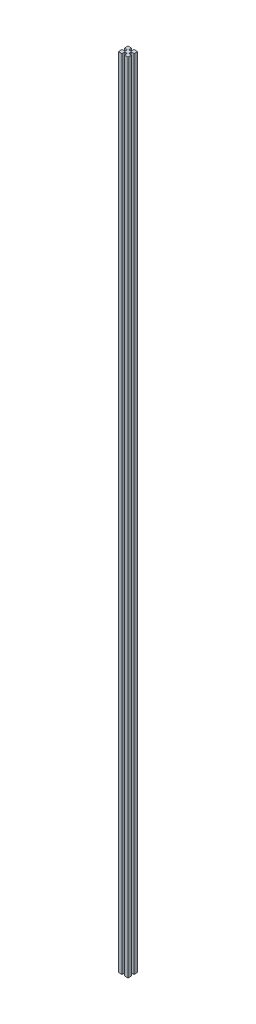
ISO-10303-21;
HEADER;
FILE_DESCRIPTION(('STEP AP214'),'2;1');
FILE_NAME('part.step','',(''),(''),'','','');
FILE_SCHEMA(('AUTOMOTIVE_DESIGN { 1 0 10303 214 1 1 1 1 }'));
ENDSEC;
DATA;
#1=APPLICATION_CONTEXT('core data for automotive mechanical design processes');
#2=APPLICATION_PROTOCOL_DEFINITION('international standard','automotive_design',2000,#1);
#3=PRODUCT_CONTEXT('',#1,'mechanical');
#4=PRODUCT('Part','Part','',(#3));
#5=PRODUCT_RELATED_PRODUCT_CATEGORY('part','',(#4));
#6=PRODUCT_DEFINITION_FORMATION('','',#4);
#7=PRODUCT_DEFINITION_CONTEXT('part definition',#1,'design');
#8=PRODUCT_DEFINITION('design','',#6,#7);
#9=PRODUCT_DEFINITION_SHAPE('','',#8);
#10=(LENGTH_UNIT() NAMED_UNIT(*) SI_UNIT(.MILLI.,.METRE.));
#11=(NAMED_UNIT(*) PLANE_ANGLE_UNIT() SI_UNIT($,.RADIAN.));
#12=(NAMED_UNIT(*) SI_UNIT($,.STERADIAN.) SOLID_ANGLE_UNIT());
#13=UNCERTAINTY_MEASURE_WITH_UNIT(LENGTH_MEASURE(1.E-05),#10,'distance_accuracy_value','');
#14=(GEOMETRIC_REPRESENTATION_CONTEXT(3) GLOBAL_UNCERTAINTY_ASSIGNED_CONTEXT((#13)) GLOBAL_UNIT_ASSIGNED_CONTEXT((#10,
#11,#12)) REPRESENTATION_CONTEXT('',''));
#15=CARTESIAN_POINT('',(0.,0.,0.));
#16=DIRECTION('',(0.,0.,1.));
#17=DIRECTION('',(1.,0.,0.));
#18=AXIS2_PLACEMENT_3D('',#15,#16,#17);
#19=CARTESIAN_POINT('',(10.,-825.5,10.));
#20=DIRECTION('',(1.,0.,0.));
#21=DIRECTION('',(0.,0.,-1.));
#22=AXIS2_PLACEMENT_3D('',#19,#20,#21);
#23=PLANE('',#22);
#24=DIRECTION('',(0.,-1.,0.));
#25=VECTOR('',#24,1.);
#26=CARTESIAN_POINT('',(10.,-825.5,2.5));
#27=LINE('',#26,#25);
#28=CARTESIAN_POINT('',(10.,825.5,2.5));
#29=VERTEX_POINT('',#28);
#30=CARTESIAN_POINT('',(10.,-825.5,2.5));
#31=VERTEX_POINT('',#30);
#32=EDGE_CURVE('E264',#29,#31,#27,.T.);
#33=ORIENTED_EDGE('',*,*,#32,.F.);
#34=DIRECTION('',(0.,0.,-1.));
#35=VECTOR('',#34,1.);
#36=CARTESIAN_POINT('',(10.,825.5,10.));
#37=LINE('',#36,#35);
#38=CARTESIAN_POINT('',(10.,825.5,10.));
#39=VERTEX_POINT('',#38);
#40=EDGE_CURVE('E270',#39,#29,#37,.T.);
#41=ORIENTED_EDGE('',*,*,#40,.F.);
#42=DIRECTION('',(0.,1.,0.));
#43=VECTOR('',#42,1.);
#44=CARTESIAN_POINT('',(10.,-825.5,10.));
#45=LINE('',#44,#43);
#46=CARTESIAN_POINT('',(10.,-825.5,10.));
#47=VERTEX_POINT('',#46);
#48=EDGE_CURVE('E301',#47,#39,#45,.T.);
#49=ORIENTED_EDGE('',*,*,#48,.F.);
#50=DIRECTION('',(0.,0.,-1.));
#51=VECTOR('',#50,1.);
#52=CARTESIAN_POINT('',(10.,-825.5,10.));
#53=LINE('',#52,#51);
#54=EDGE_CURVE('E285',#47,#31,#53,.T.);
#55=ORIENTED_EDGE('',*,*,#54,.T.);
#56=EDGE_LOOP('',(#33,#41,#49,#55));
#57=FACE_BOUND('',#56,.T.);
#58=ADVANCED_FACE('F33',(#57),#23,.T.);
#59=CARTESIAN_POINT('',(-10.,-825.5,10.));
#60=DIRECTION('',(0.,0.,1.));
#61=DIRECTION('',(1.,0.,0.));
#62=AXIS2_PLACEMENT_3D('',#59,#60,#61);
#63=PLANE('',#62);
#64=DIRECTION('',(0.,1.,0.));
#65=VECTOR('',#64,1.);
#66=CARTESIAN_POINT('',(2.5,-825.5,10.));
#67=LINE('',#66,#65);
#68=CARTESIAN_POINT('',(2.5,-825.5,10.));
#69=VERTEX_POINT('',#68);
#70=CARTESIAN_POINT('',(2.5,825.5,10.));
#71=VERTEX_POINT('',#70);
#72=EDGE_CURVE('E257',#69,#71,#67,.T.);
#73=ORIENTED_EDGE('',*,*,#72,.F.);
#74=DIRECTION('',(1.,0.,0.));
#75=VECTOR('',#74,1.);
#76=CARTESIAN_POINT('',(-10.,-825.5,10.));
#77=LINE('',#76,#75);
#78=EDGE_CURVE('E296',#69,#47,#77,.T.);
#79=ORIENTED_EDGE('',*,*,#78,.T.);
#80=ORIENTED_EDGE('',*,*,#48,.T.);
#81=DIRECTION('',(1.,0.,0.));
#82=VECTOR('',#81,1.);
#83=CARTESIAN_POINT('',(-10.,825.5,10.));
#84=LINE('',#83,#82);
#85=EDGE_CURVE('E280',#71,#39,#84,.T.);
#86=ORIENTED_EDGE('',*,*,#85,.F.);
#87=EDGE_LOOP('',(#73,#79,#80,#86));
#88=FACE_BOUND('',#87,.T.);
#89=ADVANCED_FACE('F375',(#88),#63,.T.);
#90=CARTESIAN_POINT('',(-10.,-825.5,10.));
#91=DIRECTION('',(-1.,0.,0.));
#92=DIRECTION('',(0.,0.,1.));
#93=AXIS2_PLACEMENT_3D('',#90,#91,#92);
#94=PLANE('',#93);
#95=DIRECTION('',(0.,-1.,0.));
#96=VECTOR('',#95,1.);
#97=CARTESIAN_POINT('',(-10.,-825.5,-2.5));
#98=LINE('',#97,#96);
#99=CARTESIAN_POINT('',(-10.,825.5,-2.5));
#100=VERTEX_POINT('',#99);
#101=CARTESIAN_POINT('',(-10.,-825.5,-2.5));
#102=VERTEX_POINT('',#101);
#103=EDGE_CURVE('E260',#100,#102,#98,.T.);
#104=ORIENTED_EDGE('',*,*,#103,.F.);
#105=DIRECTION('',(0.,0.,1.));
#106=VECTOR('',#105,1.);
#107=CARTESIAN_POINT('',(-10.,825.5,10.));
#108=LINE('',#107,#106);
#109=CARTESIAN_POINT('',(-10.,825.5,-10.));
#110=VERTEX_POINT('',#109);
#111=EDGE_CURVE('E277',#110,#100,#108,.T.);
#112=ORIENTED_EDGE('',*,*,#111,.F.);
#113=DIRECTION('',(0.,1.,0.));
#114=VECTOR('',#113,1.);
#115=CARTESIAN_POINT('',(-10.,-825.5,-10.));
#116=LINE('',#115,#114);
#117=CARTESIAN_POINT('',(-10.,-825.5,-10.));
#118=VERTEX_POINT('',#117);
#119=EDGE_CURVE('E308',#118,#110,#116,.T.);
#120=ORIENTED_EDGE('',*,*,#119,.F.);
#121=DIRECTION('',(0.,0.,1.));
#122=VECTOR('',#121,1.);
#123=CARTESIAN_POINT('',(-10.,-825.5,10.));
#124=LINE('',#123,#122);
#125=EDGE_CURVE('E293',#118,#102,#124,.T.);
#126=ORIENTED_EDGE('',*,*,#125,.T.);
#127=EDGE_LOOP('',(#104,#112,#120,#126));
#128=FACE_BOUND('',#127,.T.);
#129=ADVANCED_FACE('F345',(#128),#94,.T.);
#130=CARTESIAN_POINT('',(-10.,-825.5,-10.));
#131=DIRECTION('',(0.,0.,-1.));
#132=DIRECTION('',(-1.,0.,0.));
#133=AXIS2_PLACEMENT_3D('',#130,#131,#132);
#134=PLANE('',#133);
#135=DIRECTION('',(0.,-1.,0.));
#136=VECTOR('',#135,1.);
#137=CARTESIAN_POINT('',(2.5,-825.5,-10.));
#138=LINE('',#137,#136);
#139=CARTESIAN_POINT('',(2.5,825.5,-10.));
#140=VERTEX_POINT('',#139);
#141=CARTESIAN_POINT('',(2.5,-825.5,-10.));
#142=VERTEX_POINT('',#141);
#143=EDGE_CURVE('E267',#140,#142,#138,.T.);
#144=ORIENTED_EDGE('',*,*,#143,.F.);
#145=DIRECTION('',(-1.,0.,0.));
#146=VECTOR('',#145,1.);
#147=CARTESIAN_POINT('',(-10.,825.5,-10.));
#148=LINE('',#147,#146);
#149=CARTESIAN_POINT('',(10.,825.5,-10.));
#150=VERTEX_POINT('',#149);
#151=EDGE_CURVE('E274',#150,#140,#148,.T.);
#152=ORIENTED_EDGE('',*,*,#151,.F.);
#153=DIRECTION('',(0.,1.,0.));
#154=VECTOR('',#153,1.);
#155=CARTESIAN_POINT('',(10.,-825.5,-10.));
#156=LINE('',#155,#154);
#157=CARTESIAN_POINT('',(10.,-825.5,-10.));
#158=VERTEX_POINT('',#157);
#159=EDGE_CURVE('E300',#158,#150,#156,.T.);
#160=ORIENTED_EDGE('',*,*,#159,.F.);
#161=DIRECTION('',(-1.,0.,0.));
#162=VECTOR('',#161,1.);
#163=CARTESIAN_POINT('',(-10.,-825.5,-10.));
#164=LINE('',#163,#162);
#165=EDGE_CURVE('E289',#158,#142,#164,.T.);
#166=ORIENTED_EDGE('',*,*,#165,.T.);
#167=EDGE_LOOP('',(#144,#152,#160,#166));
#168=FACE_BOUND('',#167,.T.);
#169=ADVANCED_FACE('F329',(#168),#134,.T.);
#170=DIRECTION('',(0.,1.,0.));
#171=VECTOR('',#170,1.);
#172=CARTESIAN_POINT('',(10.,-825.5,-2.5));
#173=LINE('',#172,#171);
#174=CARTESIAN_POINT('',(10.,-825.5,-2.5));
#175=VERTEX_POINT('',#174);
#176=CARTESIAN_POINT('',(10.,825.5,-2.5));
#177=VERTEX_POINT('',#176);
#178=EDGE_CURVE('E262',#175,#177,#173,.T.);
#179=ORIENTED_EDGE('',*,*,#178,.F.);
#180=EDGE_CURVE('E284',#175,#158,#53,.T.);
#181=ORIENTED_EDGE('',*,*,#180,.T.);
#182=ORIENTED_EDGE('',*,*,#159,.T.);
#183=EDGE_CURVE('E269',#177,#150,#37,.T.);
#184=ORIENTED_EDGE('',*,*,#183,.F.);
#185=EDGE_LOOP('',(#179,#181,#182,#184));
#186=FACE_BOUND('',#185,.T.);
#187=ADVANCED_FACE('F35',(#186),#23,.T.);
#188=DIRECTION('',(0.,-1.,0.));
#189=VECTOR('',#188,1.);
#190=CARTESIAN_POINT('',(-2.5,-825.5,10.));
#191=LINE('',#190,#189);
#192=CARTESIAN_POINT('',(-2.5,825.5,10.));
#193=VERTEX_POINT('',#192);
#194=CARTESIAN_POINT('',(-2.5,-825.5,10.));
#195=VERTEX_POINT('',#194);
#196=EDGE_CURVE('E201',#193,#195,#191,.T.);
#197=ORIENTED_EDGE('',*,*,#196,.F.);
#198=CARTESIAN_POINT('',(-10.,825.5,10.));
#199=VERTEX_POINT('',#198);
#200=EDGE_CURVE('E281',#199,#193,#84,.T.);
#201=ORIENTED_EDGE('',*,*,#200,.F.);
#202=DIRECTION('',(0.,1.,0.));
#203=VECTOR('',#202,1.);
#204=CARTESIAN_POINT('',(-10.,-825.5,10.));
#205=LINE('',#204,#203);
#206=CARTESIAN_POINT('',(-10.,-825.5,10.));
#207=VERTEX_POINT('',#206);
#208=EDGE_CURVE('E305',#207,#199,#205,.T.);
#209=ORIENTED_EDGE('',*,*,#208,.F.);
#210=EDGE_CURVE('E297',#207,#195,#77,.T.);
#211=ORIENTED_EDGE('',*,*,#210,.T.);
#212=EDGE_LOOP('',(#197,#201,#209,#211));
#213=FACE_BOUND('',#212,.T.);
#214=ADVANCED_FACE('F361',(#213),#63,.T.);
#215=DIRECTION('',(0.,1.,0.));
#216=VECTOR('',#215,1.);
#217=CARTESIAN_POINT('',(-10.,-825.5,2.5));
#218=LINE('',#217,#216);
#219=CARTESIAN_POINT('',(-10.,-825.5,2.5));
#220=VERTEX_POINT('',#219);
#221=CARTESIAN_POINT('',(-10.,825.5,2.5));
#222=VERTEX_POINT('',#221);
#223=EDGE_CURVE('E56',#220,#222,#218,.T.);
#224=ORIENTED_EDGE('',*,*,#223,.F.);
#225=EDGE_CURVE('E292',#220,#207,#124,.T.);
#226=ORIENTED_EDGE('',*,*,#225,.T.);
#227=ORIENTED_EDGE('',*,*,#208,.T.);
#228=EDGE_CURVE('E276',#222,#199,#108,.T.);
#229=ORIENTED_EDGE('',*,*,#228,.F.);
#230=EDGE_LOOP('',(#224,#226,#227,#229));
#231=FACE_BOUND('',#230,.T.);
#232=ADVANCED_FACE('F355',(#231),#94,.T.);
#233=DIRECTION('',(0.,1.,0.));
#234=VECTOR('',#233,1.);
#235=CARTESIAN_POINT('',(-2.5,-825.5,-10.));
#236=LINE('',#235,#234);
#237=CARTESIAN_POINT('',(-2.5,-825.5,-10.));
#238=VERTEX_POINT('',#237);
#239=CARTESIAN_POINT('',(-2.5,825.5,-10.));
#240=VERTEX_POINT('',#239);
#241=EDGE_CURVE('E174',#238,#240,#236,.T.);
#242=ORIENTED_EDGE('',*,*,#241,.F.);
#243=EDGE_CURVE('E288',#238,#118,#164,.T.);
#244=ORIENTED_EDGE('',*,*,#243,.T.);
#245=ORIENTED_EDGE('',*,*,#119,.T.);
#246=EDGE_CURVE('E273',#240,#110,#148,.T.);
#247=ORIENTED_EDGE('',*,*,#246,.F.);
#248=EDGE_LOOP('',(#242,#244,#245,#247));
#249=FACE_BOUND('',#248,.T.);
#250=ADVANCED_FACE('F338',(#249),#134,.T.);
#251=CARTESIAN_POINT('',(0.,-825.5,0.));
#252=DIRECTION('',(0.,-1.,0.));
#253=DIRECTION('',(0.,0.,-1.));
#254=AXIS2_PLACEMENT_3D('',#251,#252,#253);
#255=PLANE('',#254);
#256=DIRECTION('',(0.,0.,-1.));
#257=VECTOR('',#256,1.);
#258=CARTESIAN_POINT('',(2.5,-825.5,-4.00000000000001));
#259=LINE('',#258,#257);
#260=CARTESIAN_POINT('',(2.5,-825.5,-4.00000000000001));
#261=VERTEX_POINT('',#260);
#262=EDGE_CURVE('E191',#261,#142,#259,.T.);
#263=ORIENTED_EDGE('',*,*,#262,.T.);
#264=ORIENTED_EDGE('',*,*,#165,.F.);
#265=ORIENTED_EDGE('',*,*,#180,.F.);
#266=DIRECTION('',(-1.,0.,0.));
#267=VECTOR('',#266,1.);
#268=CARTESIAN_POINT('',(4.,-825.5,-2.5));
#269=LINE('',#268,#267);
#270=CARTESIAN_POINT('',(4.,-825.5,-2.5));
#271=VERTEX_POINT('',#270);
#272=EDGE_CURVE('E209',#175,#271,#269,.T.);
#273=ORIENTED_EDGE('',*,*,#272,.T.);
#274=DIRECTION('',(0.,0.,1.));
#275=VECTOR('',#274,1.);
#276=CARTESIAN_POINT('',(4.,-825.5,-2.5));
#277=LINE('',#276,#275);
#278=CARTESIAN_POINT('',(4.,-825.5,2.5));
#279=VERTEX_POINT('',#278);
#280=EDGE_CURVE('E212',#271,#279,#277,.T.);
#281=ORIENTED_EDGE('',*,*,#280,.T.);
#282=DIRECTION('',(1.,0.,0.));
#283=VECTOR('',#282,1.);
#284=CARTESIAN_POINT('',(4.,-825.5,2.5));
#285=LINE('',#284,#283);
#286=EDGE_CURVE('E215',#279,#31,#285,.T.);
#287=ORIENTED_EDGE('',*,*,#286,.T.);
#288=ORIENTED_EDGE('',*,*,#54,.F.);
#289=ORIENTED_EDGE('',*,*,#78,.F.);
#290=DIRECTION('',(0.,0.,-1.));
#291=VECTOR('',#290,1.);
#292=CARTESIAN_POINT('',(2.5,-825.5,4.));
#293=LINE('',#292,#291);
#294=CARTESIAN_POINT('',(2.5,-825.5,4.));
#295=VERTEX_POINT('',#294);
#296=EDGE_CURVE('E250',#69,#295,#293,.T.);
#297=ORIENTED_EDGE('',*,*,#296,.T.);
#298=DIRECTION('',(-1.,0.,0.));
#299=VECTOR('',#298,1.);
#300=CARTESIAN_POINT('',(-2.5,-825.5,4.));
#301=LINE('',#300,#299);
#302=CARTESIAN_POINT('',(-2.5,-825.5,4.));
#303=VERTEX_POINT('',#302);
#304=EDGE_CURVE('E244',#295,#303,#301,.T.);
#305=ORIENTED_EDGE('',*,*,#304,.T.);
#306=DIRECTION('',(0.,0.,1.));
#307=VECTOR('',#306,1.);
#308=CARTESIAN_POINT('',(-2.5,-825.5,4.));
#309=LINE('',#308,#307);
#310=EDGE_CURVE('E247',#303,#195,#309,.T.);
#311=ORIENTED_EDGE('',*,*,#310,.T.);
#312=ORIENTED_EDGE('',*,*,#210,.F.);
#313=ORIENTED_EDGE('',*,*,#225,.F.);
#314=DIRECTION('',(1.,0.,0.));
#315=VECTOR('',#314,1.);
#316=CARTESIAN_POINT('',(-4.00000000000001,-825.5,2.5));
#317=LINE('',#316,#315);
#318=CARTESIAN_POINT('',(-4.00000000000001,-825.5,2.5));
#319=VERTEX_POINT('',#318);
#320=EDGE_CURVE('E231',#220,#319,#317,.T.);
#321=ORIENTED_EDGE('',*,*,#320,.T.);
#322=DIRECTION('',(0.,0.,-1.));
#323=VECTOR('',#322,1.);
#324=CARTESIAN_POINT('',(-4.00000000000001,-825.5,-2.5));
#325=LINE('',#324,#323);
#326=CARTESIAN_POINT('',(-4.00000000000001,-825.5,-2.5));
#327=VERTEX_POINT('',#326);
#328=EDGE_CURVE('E234',#319,#327,#325,.T.);
#329=ORIENTED_EDGE('',*,*,#328,.T.);
#330=DIRECTION('',(-1.,0.,0.));
#331=VECTOR('',#330,1.);
#332=CARTESIAN_POINT('',(-4.00000000000001,-825.5,-2.5));
#333=LINE('',#332,#331);
#334=EDGE_CURVE('E228',#327,#102,#333,.T.);
#335=ORIENTED_EDGE('',*,*,#334,.T.);
#336=ORIENTED_EDGE('',*,*,#125,.F.);
#337=ORIENTED_EDGE('',*,*,#243,.F.);
#338=DIRECTION('',(0.,0.,1.));
#339=VECTOR('',#338,1.);
#340=CARTESIAN_POINT('',(-2.5,-825.5,-4.00000000000001));
#341=LINE('',#340,#339);
#342=CARTESIAN_POINT('',(-2.5,-825.5,-4.00000000000001));
#343=VERTEX_POINT('',#342);
#344=EDGE_CURVE('E194',#238,#343,#341,.T.);
#345=ORIENTED_EDGE('',*,*,#344,.T.);
#346=DIRECTION('',(1.,0.,0.));
#347=VECTOR('',#346,1.);
#348=CARTESIAN_POINT('',(-2.5,-825.5,-4.00000000000001));
#349=LINE('',#348,#347);
#350=EDGE_CURVE('E184',#343,#261,#349,.T.);
#351=ORIENTED_EDGE('',*,*,#350,.T.);
#352=EDGE_LOOP('',(#263,#264,#265,#273,#281,#287,#288,#289,#297,#305,#311,#312,#313,#321,#329,
#335,#336,#337,#345,#351));
#353=FACE_BOUND('',#352,.T.);
#354=ADVANCED_FACE('F334',(#353),#255,.T.);
#355=CARTESIAN_POINT('',(0.,825.5,0.));
#356=DIRECTION('',(0.,-1.,0.));
#357=DIRECTION('',(0.,0.,-1.));
#358=AXIS2_PLACEMENT_3D('',#355,#356,#357);
#359=PLANE('',#358);
#360=ORIENTED_EDGE('',*,*,#151,.T.);
#361=DIRECTION('',(0.,0.,-1.));
#362=VECTOR('',#361,1.);
#363=CARTESIAN_POINT('',(2.5,825.5,-4.00000000000001));
#364=LINE('',#363,#362);
#365=CARTESIAN_POINT('',(2.5,825.5,-4.00000000000001));
#366=VERTEX_POINT('',#365);
#367=EDGE_CURVE('E190',#366,#140,#364,.T.);
#368=ORIENTED_EDGE('',*,*,#367,.F.);
#369=DIRECTION('',(1.,0.,0.));
#370=VECTOR('',#369,1.);
#371=CARTESIAN_POINT('',(-2.5,825.5,-4.00000000000001));
#372=LINE('',#371,#370);
#373=CARTESIAN_POINT('',(-2.5,825.5,-4.00000000000001));
#374=VERTEX_POINT('',#373);
#375=EDGE_CURVE('E181',#374,#366,#372,.T.);
#376=ORIENTED_EDGE('',*,*,#375,.F.);
#377=DIRECTION('',(0.,0.,-1.));
#378=VECTOR('',#377,1.);
#379=CARTESIAN_POINT('',(-2.5,825.5,0.));
#380=LINE('',#379,#378);
#381=EDGE_CURVE('E11',#374,#240,#380,.T.);
#382=ORIENTED_EDGE('',*,*,#381,.T.);
#383=ORIENTED_EDGE('',*,*,#246,.T.);
#384=ORIENTED_EDGE('',*,*,#111,.T.);
#385=DIRECTION('',(-1.,0.,0.));
#386=VECTOR('',#385,1.);
#387=CARTESIAN_POINT('',(-4.00000000000001,825.5,-2.5));
#388=LINE('',#387,#386);
#389=CARTESIAN_POINT('',(-4.00000000000001,825.5,-2.5));
#390=VERTEX_POINT('',#389);
#391=EDGE_CURVE('E222',#390,#100,#388,.T.);
#392=ORIENTED_EDGE('',*,*,#391,.F.);
#393=DIRECTION('',(0.,0.,-1.));
#394=VECTOR('',#393,1.);
#395=CARTESIAN_POINT('',(-4.00000000000001,825.5,-2.5));
#396=LINE('',#395,#394);
#397=CARTESIAN_POINT('',(-4.00000000000001,825.5,2.5));
#398=VERTEX_POINT('',#397);
#399=EDGE_CURVE('E224',#398,#390,#396,.T.);
#400=ORIENTED_EDGE('',*,*,#399,.F.);
#401=DIRECTION('',(-1.,0.,0.));
#402=VECTOR('',#401,1.);
#403=CARTESIAN_POINT('',(0.,825.5,2.5));
#404=LINE('',#403,#402);
#405=EDGE_CURVE('E315',#398,#222,#404,.T.);
#406=ORIENTED_EDGE('',*,*,#405,.T.);
#407=ORIENTED_EDGE('',*,*,#228,.T.);
#408=ORIENTED_EDGE('',*,*,#200,.T.);
#409=DIRECTION('',(0.,0.,1.));
#410=VECTOR('',#409,1.);
#411=CARTESIAN_POINT('',(-2.5,825.5,4.));
#412=LINE('',#411,#410);
#413=CARTESIAN_POINT('',(-2.5,825.5,4.));
#414=VERTEX_POINT('',#413);
#415=EDGE_CURVE('E242',#414,#193,#412,.T.);
#416=ORIENTED_EDGE('',*,*,#415,.F.);
#417=DIRECTION('',(-1.,0.,0.));
#418=VECTOR('',#417,1.);
#419=CARTESIAN_POINT('',(-2.5,825.5,4.));
#420=LINE('',#419,#418);
#421=CARTESIAN_POINT('',(2.5,825.5,4.));
#422=VERTEX_POINT('',#421);
#423=EDGE_CURVE('E48',#422,#414,#420,.T.);
#424=ORIENTED_EDGE('',*,*,#423,.F.);
#425=DIRECTION('',(0.,0.,1.));
#426=VECTOR('',#425,1.);
#427=CARTESIAN_POINT('',(2.5,825.5,0.));
#428=LINE('',#427,#426);
#429=EDGE_CURVE('E304',#422,#71,#428,.T.);
#430=ORIENTED_EDGE('',*,*,#429,.T.);
#431=ORIENTED_EDGE('',*,*,#85,.T.);
#432=ORIENTED_EDGE('',*,*,#40,.T.);
#433=DIRECTION('',(1.,0.,0.));
#434=VECTOR('',#433,1.);
#435=CARTESIAN_POINT('',(4.,825.5,2.5));
#436=LINE('',#435,#434);
#437=CARTESIAN_POINT('',(4.,825.5,2.5));
#438=VERTEX_POINT('',#437);
#439=EDGE_CURVE('E206',#438,#29,#436,.T.);
#440=ORIENTED_EDGE('',*,*,#439,.F.);
#441=DIRECTION('',(0.,0.,1.));
#442=VECTOR('',#441,1.);
#443=CARTESIAN_POINT('',(4.,825.5,-2.5));
#444=LINE('',#443,#442);
#445=CARTESIAN_POINT('',(4.,825.5,-2.5));
#446=VERTEX_POINT('',#445);
#447=EDGE_CURVE('E203',#446,#438,#444,.T.);
#448=ORIENTED_EDGE('',*,*,#447,.F.);
#449=DIRECTION('',(1.,0.,0.));
#450=VECTOR('',#449,1.);
#451=CARTESIAN_POINT('',(0.,825.5,-2.5));
#452=LINE('',#451,#450);
#453=EDGE_CURVE('E41',#446,#177,#452,.T.);
#454=ORIENTED_EDGE('',*,*,#453,.T.);
#455=ORIENTED_EDGE('',*,*,#183,.T.);
#456=EDGE_LOOP('',(#360,#368,#376,#382,#383,#384,#392,#400,#406,#407,#408,#416,#424,#430,#431,
#432,#440,#448,#454,#455));
#457=FACE_BOUND('',#456,.T.);
#458=ADVANCED_FACE('F189',(#457),#359,.F.);
#459=CARTESIAN_POINT('',(-2.5,-825.5,4.));
#460=DIRECTION('',(0.,0.,-1.));
#461=DIRECTION('',(-1.,0.,0.));
#462=AXIS2_PLACEMENT_3D('',#459,#460,#461);
#463=PLANE('',#462);
#464=DIRECTION('',(0.,1.,0.));
#465=VECTOR('',#464,1.);
#466=CARTESIAN_POINT('',(-2.5,-825.5,4.));
#467=LINE('',#466,#465);
#468=EDGE_CURVE('E253',#303,#414,#467,.T.);
#469=ORIENTED_EDGE('',*,*,#468,.F.);
#470=ORIENTED_EDGE('',*,*,#304,.F.);
#471=DIRECTION('',(0.,1.,0.));
#472=VECTOR('',#471,1.);
#473=CARTESIAN_POINT('',(2.5,-825.5,4.));
#474=LINE('',#473,#472);
#475=EDGE_CURVE('E225',#295,#422,#474,.T.);
#476=ORIENTED_EDGE('',*,*,#475,.T.);
#477=ORIENTED_EDGE('',*,*,#423,.T.);
#478=EDGE_LOOP('',(#469,#470,#476,#477));
#479=FACE_BOUND('',#478,.T.);
#480=ADVANCED_FACE('F367',(#479),#463,.F.);
#481=CARTESIAN_POINT('',(2.5,-825.5,4.));
#482=DIRECTION('',(1.,0.,0.));
#483=DIRECTION('',(0.,0.,-1.));
#484=AXIS2_PLACEMENT_3D('',#481,#482,#483);
#485=PLANE('',#484);
#486=ORIENTED_EDGE('',*,*,#72,.T.);
#487=ORIENTED_EDGE('',*,*,#429,.F.);
#488=ORIENTED_EDGE('',*,*,#475,.F.);
#489=ORIENTED_EDGE('',*,*,#296,.F.);
#490=EDGE_LOOP('',(#486,#487,#488,#489));
#491=FACE_BOUND('',#490,.T.);
#492=ADVANCED_FACE('F372',(#491),#485,.F.);
#493=CARTESIAN_POINT('',(-2.5,-825.5,4.));
#494=DIRECTION('',(-1.,0.,0.));
#495=DIRECTION('',(0.,0.,1.));
#496=AXIS2_PLACEMENT_3D('',#493,#494,#495);
#497=PLANE('',#496);
#498=ORIENTED_EDGE('',*,*,#196,.T.);
#499=ORIENTED_EDGE('',*,*,#310,.F.);
#500=ORIENTED_EDGE('',*,*,#468,.T.);
#501=ORIENTED_EDGE('',*,*,#415,.T.);
#502=EDGE_LOOP('',(#498,#499,#500,#501));
#503=FACE_BOUND('',#502,.T.);
#504=ADVANCED_FACE('F364',(#503),#497,.F.);
#505=CARTESIAN_POINT('',(-4.00000000000001,-825.5,-2.5));
#506=DIRECTION('',(0.,0.,-1.));
#507=DIRECTION('',(-1.,0.,0.));
#508=AXIS2_PLACEMENT_3D('',#505,#506,#507);
#509=PLANE('',#508);
#510=ORIENTED_EDGE('',*,*,#103,.T.);
#511=ORIENTED_EDGE('',*,*,#334,.F.);
#512=DIRECTION('',(0.,1.,0.));
#513=VECTOR('',#512,1.);
#514=CARTESIAN_POINT('',(-4.00000000000001,-825.5,-2.5));
#515=LINE('',#514,#513);
#516=EDGE_CURVE('E207',#327,#390,#515,.T.);
#517=ORIENTED_EDGE('',*,*,#516,.T.);
#518=ORIENTED_EDGE('',*,*,#391,.T.);
#519=EDGE_LOOP('',(#510,#511,#517,#518));
#520=FACE_BOUND('',#519,.T.);
#521=ADVANCED_FACE('F348',(#520),#509,.F.);
#522=CARTESIAN_POINT('',(-4.00000000000001,-825.5,-2.5));
#523=DIRECTION('',(1.,0.,0.));
#524=DIRECTION('',(0.,0.,-1.));
#525=AXIS2_PLACEMENT_3D('',#522,#523,#524);
#526=PLANE('',#525);
#527=ORIENTED_EDGE('',*,*,#516,.F.);
#528=ORIENTED_EDGE('',*,*,#328,.F.);
#529=DIRECTION('',(0.,1.,0.));
#530=VECTOR('',#529,1.);
#531=CARTESIAN_POINT('',(-4.00000000000001,-825.5,2.5));
#532=LINE('',#531,#530);
#533=EDGE_CURVE('E237',#319,#398,#532,.T.);
#534=ORIENTED_EDGE('',*,*,#533,.T.);
#535=ORIENTED_EDGE('',*,*,#399,.T.);
#536=EDGE_LOOP('',(#527,#528,#534,#535));
#537=FACE_BOUND('',#536,.T.);
#538=ADVANCED_FACE('F352',(#537),#526,.F.);
#539=CARTESIAN_POINT('',(-4.00000000000001,-825.5,2.5));
#540=DIRECTION('',(0.,0.,1.));
#541=DIRECTION('',(1.,0.,0.));
#542=AXIS2_PLACEMENT_3D('',#539,#540,#541);
#543=PLANE('',#542);
#544=ORIENTED_EDGE('',*,*,#223,.T.);
#545=ORIENTED_EDGE('',*,*,#405,.F.);
#546=ORIENTED_EDGE('',*,*,#533,.F.);
#547=ORIENTED_EDGE('',*,*,#320,.F.);
#548=EDGE_LOOP('',(#544,#545,#546,#547));
#549=FACE_BOUND('',#548,.T.);
#550=ADVANCED_FACE('F429',(#549),#543,.F.);
#551=CARTESIAN_POINT('',(4.,-825.5,2.5));
#552=DIRECTION('',(0.,0.,1.));
#553=DIRECTION('',(1.,0.,0.));
#554=AXIS2_PLACEMENT_3D('',#551,#552,#553);
#555=PLANE('',#554);
#556=ORIENTED_EDGE('',*,*,#32,.T.);
#557=ORIENTED_EDGE('',*,*,#286,.F.);
#558=DIRECTION('',(0.,1.,0.));
#559=VECTOR('',#558,1.);
#560=CARTESIAN_POINT('',(4.,-825.5,2.5));
#561=LINE('',#560,#559);
#562=EDGE_CURVE('E196',#279,#438,#561,.T.);
#563=ORIENTED_EDGE('',*,*,#562,.T.);
#564=ORIENTED_EDGE('',*,*,#439,.T.);
#565=EDGE_LOOP('',(#556,#557,#563,#564));
#566=FACE_BOUND('',#565,.T.);
#567=ADVANCED_FACE('F382',(#566),#555,.F.);
#568=CARTESIAN_POINT('',(4.,-825.5,-2.5));
#569=DIRECTION('',(-1.,0.,0.));
#570=DIRECTION('',(0.,0.,1.));
#571=AXIS2_PLACEMENT_3D('',#568,#569,#570);
#572=PLANE('',#571);
#573=ORIENTED_EDGE('',*,*,#562,.F.);
#574=ORIENTED_EDGE('',*,*,#280,.F.);
#575=DIRECTION('',(0.,1.,0.));
#576=VECTOR('',#575,1.);
#577=CARTESIAN_POINT('',(4.,-825.5,-2.5));
#578=LINE('',#577,#576);
#579=EDGE_CURVE('E218',#271,#446,#578,.T.);
#580=ORIENTED_EDGE('',*,*,#579,.T.);
#581=ORIENTED_EDGE('',*,*,#447,.T.);
#582=EDGE_LOOP('',(#573,#574,#580,#581));
#583=FACE_BOUND('',#582,.T.);
#584=ADVANCED_FACE('F385',(#583),#572,.F.);
#585=CARTESIAN_POINT('',(4.,-825.5,-2.5));
#586=DIRECTION('',(0.,0.,-1.));
#587=DIRECTION('',(-1.,0.,0.));
#588=AXIS2_PLACEMENT_3D('',#585,#586,#587);
#589=PLANE('',#588);
#590=ORIENTED_EDGE('',*,*,#178,.T.);
#591=ORIENTED_EDGE('',*,*,#453,.F.);
#592=ORIENTED_EDGE('',*,*,#579,.F.);
#593=ORIENTED_EDGE('',*,*,#272,.F.);
#594=EDGE_LOOP('',(#590,#591,#592,#593));
#595=FACE_BOUND('',#594,.T.);
#596=ADVANCED_FACE('F386',(#595),#589,.F.);
#597=CARTESIAN_POINT('',(2.5,-825.5,-4.00000000000001));
#598=DIRECTION('',(1.,0.,0.));
#599=DIRECTION('',(0.,0.,-1.));
#600=AXIS2_PLACEMENT_3D('',#597,#598,#599);
#601=PLANE('',#600);
#602=ORIENTED_EDGE('',*,*,#143,.T.);
#603=ORIENTED_EDGE('',*,*,#262,.F.);
#604=DIRECTION('',(0.,1.,0.));
#605=VECTOR('',#604,1.);
#606=CARTESIAN_POINT('',(2.5,-825.5,-4.00000000000001));
#607=LINE('',#606,#605);
#608=EDGE_CURVE('E186',#261,#366,#607,.T.);
#609=ORIENTED_EDGE('',*,*,#608,.T.);
#610=ORIENTED_EDGE('',*,*,#367,.T.);
#611=EDGE_LOOP('',(#602,#603,#609,#610));
#612=FACE_BOUND('',#611,.T.);
#613=ADVANCED_FACE('F332',(#612),#601,.F.);
#614=CARTESIAN_POINT('',(-2.5,-825.5,-4.00000000000001));
#615=DIRECTION('',(0.,0.,1.));
#616=DIRECTION('',(1.,0.,0.));
#617=AXIS2_PLACEMENT_3D('',#614,#615,#616);
#618=PLANE('',#617);
#619=ORIENTED_EDGE('',*,*,#608,.F.);
#620=ORIENTED_EDGE('',*,*,#350,.F.);
#621=DIRECTION('',(0.,1.,0.));
#622=VECTOR('',#621,1.);
#623=CARTESIAN_POINT('',(-2.5,-825.5,-4.00000000000001));
#624=LINE('',#623,#622);
#625=EDGE_CURVE('E171',#343,#374,#624,.T.);
#626=ORIENTED_EDGE('',*,*,#625,.T.);
#627=ORIENTED_EDGE('',*,*,#375,.T.);
#628=EDGE_LOOP('',(#619,#620,#626,#627));
#629=FACE_BOUND('',#628,.T.);
#630=ADVANCED_FACE('F180',(#629),#618,.F.);
#631=CARTESIAN_POINT('',(-2.5,-825.5,-4.00000000000001));
#632=DIRECTION('',(-1.,0.,0.));
#633=DIRECTION('',(0.,0.,1.));
#634=AXIS2_PLACEMENT_3D('',#631,#632,#633);
#635=PLANE('',#634);
#636=ORIENTED_EDGE('',*,*,#241,.T.);
#637=ORIENTED_EDGE('',*,*,#381,.F.);
#638=ORIENTED_EDGE('',*,*,#625,.F.);
#639=ORIENTED_EDGE('',*,*,#344,.F.);
#640=EDGE_LOOP('',(#636,#637,#638,#639));
#641=FACE_BOUND('',#640,.T.);
#642=ADVANCED_FACE('F170',(#641),#635,.F.);
#643=CLOSED_SHELL('',(#58,#89,#129,#169,#187,#214,#232,#250,#354,#458,#480,#492,#504,#521,#538,
#550,#567,#584,#596,#613,#630,#642));
#644=MANIFOLD_SOLID_BREP('B2',#643);
#645=ADVANCED_BREP_SHAPE_REPRESENTATION('',(#18,#644),#14);
#646=SHAPE_DEFINITION_REPRESENTATION(#9,#645);
ENDSEC;
END-ISO-10303-21;
